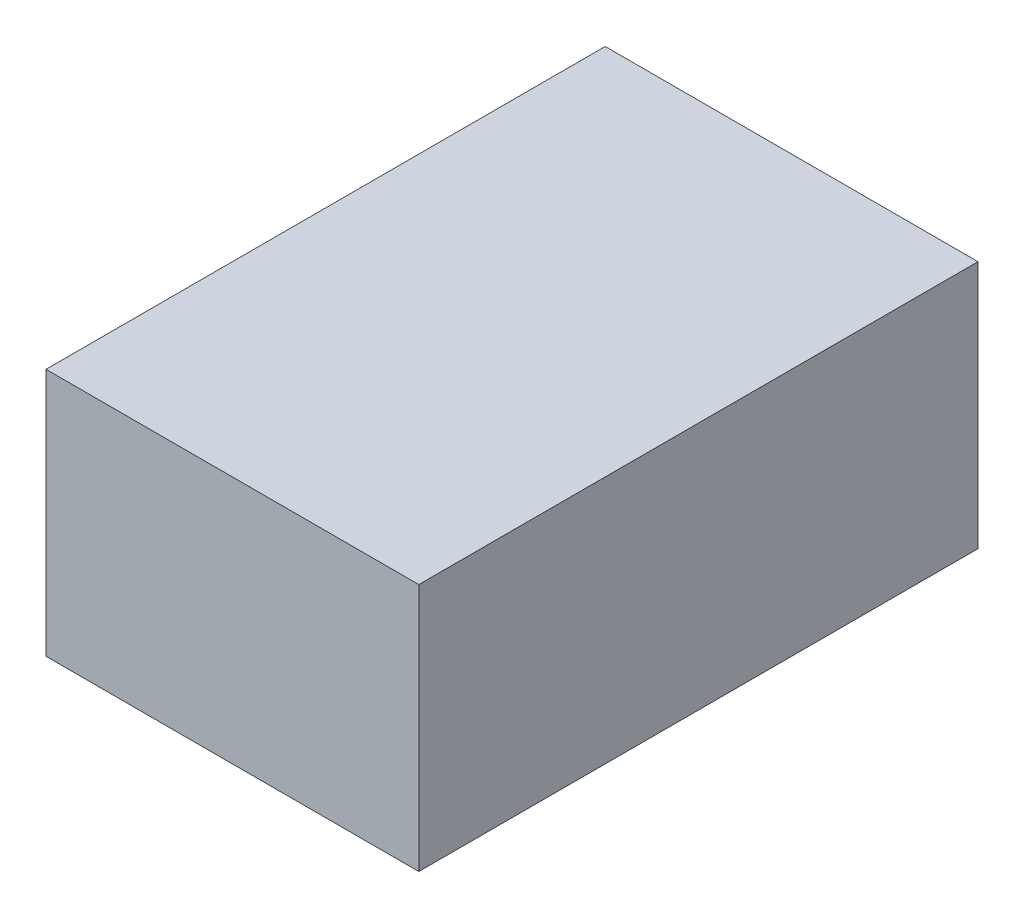
ISO-10303-21;
HEADER;
FILE_DESCRIPTION(('STEP AP214'),'2;1');
FILE_NAME('part.step','',(''),(''),'','','');
FILE_SCHEMA(('AUTOMOTIVE_DESIGN { 1 0 10303 214 1 1 1 1 }'));
ENDSEC;
DATA;
#1=APPLICATION_CONTEXT('core data for automotive mechanical design processes');
#2=APPLICATION_PROTOCOL_DEFINITION('international standard','automotive_design',2000,#1);
#3=PRODUCT_CONTEXT('',#1,'mechanical');
#4=PRODUCT('Part','Part','',(#3));
#5=PRODUCT_RELATED_PRODUCT_CATEGORY('part','',(#4));
#6=PRODUCT_DEFINITION_FORMATION('','',#4);
#7=PRODUCT_DEFINITION_CONTEXT('part definition',#1,'design');
#8=PRODUCT_DEFINITION('design','',#6,#7);
#9=PRODUCT_DEFINITION_SHAPE('','',#8);
#10=(LENGTH_UNIT() NAMED_UNIT(*) SI_UNIT(.MILLI.,.METRE.));
#11=(NAMED_UNIT(*) PLANE_ANGLE_UNIT() SI_UNIT($,.RADIAN.));
#12=(NAMED_UNIT(*) SI_UNIT($,.STERADIAN.) SOLID_ANGLE_UNIT());
#13=UNCERTAINTY_MEASURE_WITH_UNIT(LENGTH_MEASURE(1.E-05),#10,'distance_accuracy_value','');
#14=(GEOMETRIC_REPRESENTATION_CONTEXT(3) GLOBAL_UNCERTAINTY_ASSIGNED_CONTEXT((#13)) GLOBAL_UNIT_ASSIGNED_CONTEXT((#10,
#11,#12)) REPRESENTATION_CONTEXT('',''));
#15=CARTESIAN_POINT('',(0.,0.,0.));
#16=DIRECTION('',(0.,0.,1.));
#17=DIRECTION('',(1.,0.,0.));
#18=AXIS2_PLACEMENT_3D('',#15,#16,#17);
#19=CARTESIAN_POINT('',(76.2,-14.9023121387283,114.3));
#20=DIRECTION('',(0.,1.,0.));
#21=DIRECTION('',(-1.,0.,0.));
#22=AXIS2_PLACEMENT_3D('',#19,#20,#21);
#23=PLANE('',#22);
#24=CARTESIAN_POINT('',(6.35,-14.9023121387283,6.34999999999999));
#25=DIRECTION('',(0.,-1.,0.));
#26=DIRECTION('',(1.,0.,0.));
#27=AXIS2_PLACEMENT_3D('',#24,#25,#26);
#28=CIRCLE('',#27,2.286);
#29=CARTESIAN_POINT('',(8.636,-14.9023121387283,6.34999999999999));
#30=VERTEX_POINT('',#29);
#31=EDGE_CURVE('E243',#30,#30,#28,.T.);
#32=ORIENTED_EDGE('',*,*,#31,.F.);
#33=EDGE_LOOP('',(#32));
#34=FACE_BOUND('',#33,.T.);
#35=CARTESIAN_POINT('',(6.35,-14.9023121387283,107.95));
#36=DIRECTION('',(0.,-1.,0.));
#37=DIRECTION('',(1.,0.,0.));
#38=AXIS2_PLACEMENT_3D('',#35,#36,#37);
#39=CIRCLE('',#38,2.286);
#40=CARTESIAN_POINT('',(8.636,-14.9023121387283,107.95));
#41=VERTEX_POINT('',#40);
#42=EDGE_CURVE('E251',#41,#41,#39,.T.);
#43=ORIENTED_EDGE('',*,*,#42,.F.);
#44=EDGE_LOOP('',(#43));
#45=FACE_BOUND('',#44,.T.);
#46=CARTESIAN_POINT('',(69.85,-14.9023121387283,107.95));
#47=DIRECTION('',(0.,-1.,0.));
#48=DIRECTION('',(1.,0.,0.));
#49=AXIS2_PLACEMENT_3D('',#46,#47,#48);
#50=CIRCLE('',#49,2.28599999999999);
#51=CARTESIAN_POINT('',(72.136,-14.9023121387283,107.95));
#52=VERTEX_POINT('',#51);
#53=EDGE_CURVE('E236',#52,#52,#50,.T.);
#54=ORIENTED_EDGE('',*,*,#53,.F.);
#55=EDGE_LOOP('',(#54));
#56=FACE_BOUND('',#55,.T.);
#57=CARTESIAN_POINT('',(69.85,-14.9023121387283,6.35000000000001));
#58=DIRECTION('',(0.,-1.,0.));
#59=DIRECTION('',(1.,0.,0.));
#60=AXIS2_PLACEMENT_3D('',#57,#58,#59);
#61=CIRCLE('',#60,2.28599999999999);
#62=CARTESIAN_POINT('',(72.136,-14.9023121387283,6.35000000000001));
#63=VERTEX_POINT('',#62);
#64=EDGE_CURVE('E250',#63,#63,#61,.T.);
#65=ORIENTED_EDGE('',*,*,#64,.F.);
#66=EDGE_LOOP('',(#65));
#67=FACE_BOUND('',#66,.T.);
#68=DIRECTION('',(1.,0.,0.));
#69=VECTOR('',#68,1.);
#70=CARTESIAN_POINT('',(76.2,-14.9023121387283,0.));
#71=LINE('',#70,#69);
#72=CARTESIAN_POINT('',(0.,-14.9023121387283,0.));
#73=VERTEX_POINT('',#72);
#74=CARTESIAN_POINT('',(76.2,-14.9023121387283,0.));
#75=VERTEX_POINT('',#74);
#76=EDGE_CURVE('E372',#73,#75,#71,.T.);
#77=ORIENTED_EDGE('',*,*,#76,.T.);
#78=DIRECTION('',(0.,0.,-1.));
#79=VECTOR('',#78,1.);
#80=CARTESIAN_POINT('',(76.2,-14.9023121387283,114.3));
#81=LINE('',#80,#79);
#82=CARTESIAN_POINT('',(76.2,-14.9023121387283,114.3));
#83=VERTEX_POINT('',#82);
#84=EDGE_CURVE('E377',#83,#75,#81,.T.);
#85=ORIENTED_EDGE('',*,*,#84,.F.);
#86=DIRECTION('',(1.,0.,0.));
#87=VECTOR('',#86,1.);
#88=CARTESIAN_POINT('',(76.2,-14.9023121387283,114.3));
#89=LINE('',#88,#87);
#90=CARTESIAN_POINT('',(0.,-14.9023121387283,114.3));
#91=VERTEX_POINT('',#90);
#92=EDGE_CURVE('E363',#91,#83,#89,.T.);
#93=ORIENTED_EDGE('',*,*,#92,.F.);
#94=DIRECTION('',(0.,0.,-1.));
#95=VECTOR('',#94,1.);
#96=CARTESIAN_POINT('',(0.,-14.9023121387283,114.3));
#97=LINE('',#96,#95);
#98=EDGE_CURVE('E380',#91,#73,#97,.T.);
#99=ORIENTED_EDGE('',*,*,#98,.T.);
#100=EDGE_LOOP('',(#77,#85,#93,#99));
#101=FACE_BOUND('',#100,.T.);
#102=DIRECTION('',(-1.,0.,0.));
#103=VECTOR('',#102,1.);
#104=CARTESIAN_POINT('',(0.,-14.9023121387283,10.6679999999999));
#105=LINE('',#104,#103);
#106=CARTESIAN_POINT('',(10.6679999999999,-14.9023121387283,10.6679999999999));
#107=VERTEX_POINT('',#106);
#108=CARTESIAN_POINT('',(1.778,-14.9023121387283,10.6679999999999));
#109=VERTEX_POINT('',#108);
#110=EDGE_CURVE('E266',#107,#109,#105,.T.);
#111=ORIENTED_EDGE('',*,*,#110,.T.);
#112=DIRECTION('',(0.,0.,-1.));
#113=VECTOR('',#112,1.);
#114=CARTESIAN_POINT('',(1.778,-14.9023121387283,0.));
#115=LINE('',#114,#113);
#116=CARTESIAN_POINT('',(1.778,-14.9023121387283,103.632));
#117=VERTEX_POINT('',#116);
#118=EDGE_CURVE('E270',#117,#109,#115,.T.);
#119=ORIENTED_EDGE('',*,*,#118,.F.);
#120=DIRECTION('',(1.,0.,0.));
#121=VECTOR('',#120,1.);
#122=CARTESIAN_POINT('',(0.,-14.9023121387283,103.632));
#123=LINE('',#122,#121);
#124=CARTESIAN_POINT('',(10.668,-14.9023121387283,103.632));
#125=VERTEX_POINT('',#124);
#126=EDGE_CURVE('E327',#117,#125,#123,.T.);
#127=ORIENTED_EDGE('',*,*,#126,.T.);
#128=DIRECTION('',(0.,0.,-1.));
#129=VECTOR('',#128,1.);
#130=CARTESIAN_POINT('',(10.668,-14.9023121387283,0.));
#131=LINE('',#130,#129);
#132=CARTESIAN_POINT('',(10.668,-14.9023121387283,112.522));
#133=VERTEX_POINT('',#132);
#134=EDGE_CURVE('E324',#133,#125,#131,.T.);
#135=ORIENTED_EDGE('',*,*,#134,.F.);
#136=DIRECTION('',(1.,0.,0.));
#137=VECTOR('',#136,1.);
#138=CARTESIAN_POINT('',(0.,-14.9023121387283,112.522));
#139=LINE('',#138,#137);
#140=CARTESIAN_POINT('',(65.532,-14.9023121387283,112.522));
#141=VERTEX_POINT('',#140);
#142=EDGE_CURVE('E321',#133,#141,#139,.T.);
#143=ORIENTED_EDGE('',*,*,#142,.T.);
#144=DIRECTION('',(0.,0.,-1.));
#145=VECTOR('',#144,1.);
#146=CARTESIAN_POINT('',(65.532,-14.9023121387283,0.));
#147=LINE('',#146,#145);
#148=CARTESIAN_POINT('',(65.532,-14.9023121387283,103.632));
#149=VERTEX_POINT('',#148);
#150=EDGE_CURVE('E318',#141,#149,#147,.T.);
#151=ORIENTED_EDGE('',*,*,#150,.T.);
#152=DIRECTION('',(-1.,0.,0.));
#153=VECTOR('',#152,1.);
#154=CARTESIAN_POINT('',(0.,-14.9023121387283,103.632));
#155=LINE('',#154,#153);
#156=CARTESIAN_POINT('',(74.422,-14.9023121387283,103.632));
#157=VERTEX_POINT('',#156);
#158=EDGE_CURVE('E315',#157,#149,#155,.T.);
#159=ORIENTED_EDGE('',*,*,#158,.F.);
#160=DIRECTION('',(0.,0.,-1.));
#161=VECTOR('',#160,1.);
#162=CARTESIAN_POINT('',(74.422,-14.9023121387283,0.));
#163=LINE('',#162,#161);
#164=CARTESIAN_POINT('',(74.422,-14.9023121387283,10.668));
#165=VERTEX_POINT('',#164);
#166=EDGE_CURVE('E312',#157,#165,#163,.T.);
#167=ORIENTED_EDGE('',*,*,#166,.T.);
#168=DIRECTION('',(-1.,0.,0.));
#169=VECTOR('',#168,1.);
#170=CARTESIAN_POINT('',(0.,-14.9023121387283,10.668));
#171=LINE('',#170,#169);
#172=CARTESIAN_POINT('',(65.532,-14.9023121387283,10.668));
#173=VERTEX_POINT('',#172);
#174=EDGE_CURVE('E309',#165,#173,#171,.T.);
#175=ORIENTED_EDGE('',*,*,#174,.T.);
#176=DIRECTION('',(0.,0.,-1.));
#177=VECTOR('',#176,1.);
#178=CARTESIAN_POINT('',(65.532,-14.9023121387283,0.));
#179=LINE('',#178,#177);
#180=CARTESIAN_POINT('',(65.532,-14.9023121387283,1.778));
#181=VERTEX_POINT('',#180);
#182=EDGE_CURVE('E306',#173,#181,#179,.T.);
#183=ORIENTED_EDGE('',*,*,#182,.T.);
#184=DIRECTION('',(1.,0.,0.));
#185=VECTOR('',#184,1.);
#186=CARTESIAN_POINT('',(0.,-14.9023121387283,1.778));
#187=LINE('',#186,#185);
#188=CARTESIAN_POINT('',(10.6679999999999,-14.9023121387283,1.778));
#189=VERTEX_POINT('',#188);
#190=EDGE_CURVE('E303',#189,#181,#187,.T.);
#191=ORIENTED_EDGE('',*,*,#190,.F.);
#192=DIRECTION('',(0.,0.,-1.));
#193=VECTOR('',#192,1.);
#194=CARTESIAN_POINT('',(10.6679999999999,-14.9023121387283,0.));
#195=LINE('',#194,#193);
#196=EDGE_CURVE('E300',#107,#189,#195,.T.);
#197=ORIENTED_EDGE('',*,*,#196,.F.);
#198=EDGE_LOOP('',(#111,#119,#127,#135,#143,#151,#159,#167,#175,#183,#191,#197));
#199=FACE_BOUND('',#198,.T.);
#200=ADVANCED_FACE('F33',(#34,#45,#56,#67,#101,#199),#23,.F.);
#201=CARTESIAN_POINT('',(0.,35.8976878612717,114.3));
#202=DIRECTION('',(0.,-1.,0.));
#203=DIRECTION('',(1.,0.,0.));
#204=AXIS2_PLACEMENT_3D('',#201,#202,#203);
#205=PLANE('',#204);
#206=DIRECTION('',(-1.,0.,0.));
#207=VECTOR('',#206,1.);
#208=CARTESIAN_POINT('',(0.,35.8976878612717,0.));
#209=LINE('',#208,#207);
#210=CARTESIAN_POINT('',(76.2,35.8976878612717,0.));
#211=VERTEX_POINT('',#210);
#212=CARTESIAN_POINT('',(0.,35.8976878612717,0.));
#213=VERTEX_POINT('',#212);
#214=EDGE_CURVE('E334',#211,#213,#209,.T.);
#215=ORIENTED_EDGE('',*,*,#214,.T.);
#216=DIRECTION('',(0.,0.,-1.));
#217=VECTOR('',#216,1.);
#218=CARTESIAN_POINT('',(0.,35.8976878612717,114.3));
#219=LINE('',#218,#217);
#220=CARTESIAN_POINT('',(0.,35.8976878612717,114.3));
#221=VERTEX_POINT('',#220);
#222=EDGE_CURVE('E383',#221,#213,#219,.T.);
#223=ORIENTED_EDGE('',*,*,#222,.F.);
#224=DIRECTION('',(-1.,0.,0.));
#225=VECTOR('',#224,1.);
#226=CARTESIAN_POINT('',(0.,35.8976878612717,114.3));
#227=LINE('',#226,#225);
#228=CARTESIAN_POINT('',(76.2,35.8976878612717,114.3));
#229=VERTEX_POINT('',#228);
#230=EDGE_CURVE('E357',#229,#221,#227,.T.);
#231=ORIENTED_EDGE('',*,*,#230,.F.);
#232=DIRECTION('',(0.,0.,-1.));
#233=VECTOR('',#232,1.);
#234=CARTESIAN_POINT('',(76.2,35.8976878612717,114.3));
#235=LINE('',#234,#233);
#236=EDGE_CURVE('E367',#229,#211,#235,.T.);
#237=ORIENTED_EDGE('',*,*,#236,.T.);
#238=EDGE_LOOP('',(#215,#223,#231,#237));
#239=FACE_BOUND('',#238,.T.);
#240=ADVANCED_FACE('F35',(#239),#205,.F.);
#241=CARTESIAN_POINT('',(0.,35.8976878612717,114.3));
#242=DIRECTION('',(1.,0.,0.));
#243=DIRECTION('',(0.,1.,0.));
#244=AXIS2_PLACEMENT_3D('',#241,#242,#243);
#245=PLANE('',#244);
#246=DIRECTION('',(0.,-1.,0.));
#247=VECTOR('',#246,1.);
#248=CARTESIAN_POINT('',(0.,35.8976878612717,0.));
#249=LINE('',#248,#247);
#250=EDGE_CURVE('E370',#213,#73,#249,.T.);
#251=ORIENTED_EDGE('',*,*,#250,.T.);
#252=ORIENTED_EDGE('',*,*,#98,.F.);
#253=DIRECTION('',(0.,-1.,0.));
#254=VECTOR('',#253,1.);
#255=CARTESIAN_POINT('',(0.,35.8976878612717,114.3));
#256=LINE('',#255,#254);
#257=EDGE_CURVE('E360',#221,#91,#256,.T.);
#258=ORIENTED_EDGE('',*,*,#257,.F.);
#259=ORIENTED_EDGE('',*,*,#222,.T.);
#260=EDGE_LOOP('',(#251,#252,#258,#259));
#261=FACE_BOUND('',#260,.T.);
#262=ADVANCED_FACE('F427',(#261),#245,.F.);
#263=CARTESIAN_POINT('',(76.2,35.8976878612717,114.3));
#264=DIRECTION('',(-1.,0.,0.));
#265=DIRECTION('',(0.,0.,1.));
#266=AXIS2_PLACEMENT_3D('',#263,#264,#265);
#267=PLANE('',#266);
#268=DIRECTION('',(0.,1.,0.));
#269=VECTOR('',#268,1.);
#270=CARTESIAN_POINT('',(76.2,35.8976878612717,0.));
#271=LINE('',#270,#269);
#272=EDGE_CURVE('E361',#75,#211,#271,.T.);
#273=ORIENTED_EDGE('',*,*,#272,.T.);
#274=ORIENTED_EDGE('',*,*,#236,.F.);
#275=DIRECTION('',(0.,1.,0.));
#276=VECTOR('',#275,1.);
#277=CARTESIAN_POINT('',(76.2,35.8976878612717,114.3));
#278=LINE('',#277,#276);
#279=EDGE_CURVE('E365',#83,#229,#278,.T.);
#280=ORIENTED_EDGE('',*,*,#279,.F.);
#281=ORIENTED_EDGE('',*,*,#84,.T.);
#282=EDGE_LOOP('',(#273,#274,#280,#281));
#283=FACE_BOUND('',#282,.T.);
#284=ADVANCED_FACE('F432',(#283),#267,.F.);
#285=CARTESIAN_POINT('',(0.,0.,114.3));
#286=DIRECTION('',(0.,0.,-1.));
#287=DIRECTION('',(-1.,0.,0.));
#288=AXIS2_PLACEMENT_3D('',#285,#286,#287);
#289=PLANE('',#288);
#290=ORIENTED_EDGE('',*,*,#230,.T.);
#291=ORIENTED_EDGE('',*,*,#257,.T.);
#292=ORIENTED_EDGE('',*,*,#92,.T.);
#293=ORIENTED_EDGE('',*,*,#279,.T.);
#294=EDGE_LOOP('',(#290,#291,#292,#293));
#295=FACE_BOUND('',#294,.T.);
#296=ADVANCED_FACE('F439',(#295),#289,.F.);
#297=CARTESIAN_POINT('',(0.,0.,0.));
#298=DIRECTION('',(0.,0.,-1.));
#299=DIRECTION('',(-1.,0.,0.));
#300=AXIS2_PLACEMENT_3D('',#297,#298,#299);
#301=PLANE('',#300);
#302=DIRECTION('',(0.,-1.,0.));
#303=VECTOR('',#302,1.);
#304=CARTESIAN_POINT('',(28.26,33.3576878612717,0.));
#305=LINE('',#304,#303);
#306=CARTESIAN_POINT('',(28.26,33.3576878612717,0.));
#307=VERTEX_POINT('',#306);
#308=CARTESIAN_POINT('',(28.26,18.1176878612717,0.));
#309=VERTEX_POINT('',#308);
#310=EDGE_CURVE('E48',#307,#309,#305,.T.);
#311=ORIENTED_EDGE('',*,*,#310,.F.);
#312=DIRECTION('',(1.,0.,0.));
#313=VECTOR('',#312,1.);
#314=CARTESIAN_POINT('',(28.26,33.3576878612717,0.));
#315=LINE('',#314,#313);
#316=CARTESIAN_POINT('',(11.242,33.3576878612717,0.));
#317=VERTEX_POINT('',#316);
#318=EDGE_CURVE('E213',#317,#307,#315,.T.);
#319=ORIENTED_EDGE('',*,*,#318,.F.);
#320=DIRECTION('',(0.,1.,0.));
#321=VECTOR('',#320,1.);
#322=CARTESIAN_POINT('',(11.242,33.3576878612717,0.));
#323=LINE('',#322,#321);
#324=CARTESIAN_POINT('',(11.242,18.1176878612717,0.));
#325=VERTEX_POINT('',#324);
#326=EDGE_CURVE('E197',#325,#317,#323,.T.);
#327=ORIENTED_EDGE('',*,*,#326,.F.);
#328=DIRECTION('',(-1.,0.,0.));
#329=VECTOR('',#328,1.);
#330=CARTESIAN_POINT('',(28.26,18.1176878612717,0.));
#331=LINE('',#330,#329);
#332=EDGE_CURVE('E206',#309,#325,#331,.T.);
#333=ORIENTED_EDGE('',*,*,#332,.F.);
#334=EDGE_LOOP('',(#311,#319,#327,#333));
#335=FACE_BOUND('',#334,.T.);
#336=DIRECTION('',(0.,-1.,0.));
#337=VECTOR('',#336,1.);
#338=CARTESIAN_POINT('',(63.5,33.3576878612717,0.));
#339=LINE('',#338,#337);
#340=CARTESIAN_POINT('',(63.5,33.3576878612717,0.));
#341=VERTEX_POINT('',#340);
#342=CARTESIAN_POINT('',(63.5,18.1176878612717,0.));
#343=VERTEX_POINT('',#342);
#344=EDGE_CURVE('E220',#341,#343,#339,.T.);
#345=ORIENTED_EDGE('',*,*,#344,.F.);
#346=DIRECTION('',(1.,0.,0.));
#347=VECTOR('',#346,1.);
#348=CARTESIAN_POINT('',(63.5,33.3576878612717,0.));
#349=LINE('',#348,#347);
#350=CARTESIAN_POINT('',(48.26,33.3576878612717,0.));
#351=VERTEX_POINT('',#350);
#352=EDGE_CURVE('E230',#351,#341,#349,.T.);
#353=ORIENTED_EDGE('',*,*,#352,.F.);
#354=DIRECTION('',(0.,1.,0.));
#355=VECTOR('',#354,1.);
#356=CARTESIAN_POINT('',(48.26,33.3576878612717,0.));
#357=LINE('',#356,#355);
#358=CARTESIAN_POINT('',(48.26,18.1176878612717,0.));
#359=VERTEX_POINT('',#358);
#360=EDGE_CURVE('E227',#359,#351,#357,.T.);
#361=ORIENTED_EDGE('',*,*,#360,.F.);
#362=DIRECTION('',(-1.,0.,0.));
#363=VECTOR('',#362,1.);
#364=CARTESIAN_POINT('',(63.5,18.1176878612717,0.));
#365=LINE('',#364,#363);
#366=EDGE_CURVE('E224',#343,#359,#365,.T.);
#367=ORIENTED_EDGE('',*,*,#366,.F.);
#368=EDGE_LOOP('',(#345,#353,#361,#367));
#369=FACE_BOUND('',#368,.T.);
#370=ORIENTED_EDGE('',*,*,#214,.F.);
#371=ORIENTED_EDGE('',*,*,#272,.F.);
#372=ORIENTED_EDGE('',*,*,#76,.F.);
#373=ORIENTED_EDGE('',*,*,#250,.F.);
#374=EDGE_LOOP('',(#370,#371,#372,#373));
#375=FACE_BOUND('',#374,.T.);
#376=ADVANCED_FACE('F210',(#335,#369,#375),#301,.T.);
#377=CARTESIAN_POINT('',(0.,34.1196878612717,10.6679999999999));
#378=DIRECTION('',(0.,0.,1.));
#379=DIRECTION('',(1.,0.,0.));
#380=AXIS2_PLACEMENT_3D('',#377,#378,#379);
#381=PLANE('',#380);
#382=ORIENTED_EDGE('',*,*,#110,.F.);
#383=DIRECTION('',(0.,-1.,0.));
#384=VECTOR('',#383,1.);
#385=CARTESIAN_POINT('',(10.6679999999999,34.1196878612717,10.6679999999999));
#386=LINE('',#385,#384);
#387=CARTESIAN_POINT('',(10.6679999999999,34.1196878612717,10.6679999999999));
#388=VERTEX_POINT('',#387);
#389=EDGE_CURVE('E297',#388,#107,#386,.T.);
#390=ORIENTED_EDGE('',*,*,#389,.F.);
#391=DIRECTION('',(-1.,0.,0.));
#392=VECTOR('',#391,1.);
#393=CARTESIAN_POINT('',(0.,34.1196878612717,10.6679999999999));
#394=LINE('',#393,#392);
#395=CARTESIAN_POINT('',(1.778,34.1196878612717,10.6679999999999));
#396=VERTEX_POINT('',#395);
#397=EDGE_CURVE('E267',#388,#396,#394,.T.);
#398=ORIENTED_EDGE('',*,*,#397,.T.);
#399=DIRECTION('',(0.,-1.,0.));
#400=VECTOR('',#399,1.);
#401=CARTESIAN_POINT('',(1.778,34.1196878612717,10.6679999999999));
#402=LINE('',#401,#400);
#403=EDGE_CURVE('E332',#396,#109,#402,.T.);
#404=ORIENTED_EDGE('',*,*,#403,.T.);
#405=EDGE_LOOP('',(#382,#390,#398,#404));
#406=FACE_BOUND('',#405,.T.);
#407=ADVANCED_FACE('F460',(#406),#381,.T.);
#408=CARTESIAN_POINT('',(1.778,34.1196878612717,0.));
#409=DIRECTION('',(-1.,0.,0.));
#410=DIRECTION('',(0.,-1.,0.));
#411=AXIS2_PLACEMENT_3D('',#408,#409,#410);
#412=PLANE('',#411);
#413=ORIENTED_EDGE('',*,*,#118,.T.);
#414=ORIENTED_EDGE('',*,*,#403,.F.);
#415=DIRECTION('',(0.,0.,-1.));
#416=VECTOR('',#415,1.);
#417=CARTESIAN_POINT('',(1.778,34.1196878612717,0.));
#418=LINE('',#417,#416);
#419=CARTESIAN_POINT('',(1.778,34.1196878612717,103.632));
#420=VERTEX_POINT('',#419);
#421=EDGE_CURVE('E294',#420,#396,#418,.T.);
#422=ORIENTED_EDGE('',*,*,#421,.F.);
#423=DIRECTION('',(0.,-1.,0.));
#424=VECTOR('',#423,1.);
#425=CARTESIAN_POINT('',(1.778,34.1196878612717,103.632));
#426=LINE('',#425,#424);
#427=EDGE_CURVE('E335',#420,#117,#426,.T.);
#428=ORIENTED_EDGE('',*,*,#427,.T.);
#429=EDGE_LOOP('',(#413,#414,#422,#428));
#430=FACE_BOUND('',#429,.T.);
#431=ADVANCED_FACE('F464',(#430),#412,.F.);
#432=CARTESIAN_POINT('',(0.,34.1196878612717,103.632));
#433=DIRECTION('',(0.,0.,-1.));
#434=DIRECTION('',(-1.,0.,0.));
#435=AXIS2_PLACEMENT_3D('',#432,#433,#434);
#436=PLANE('',#435);
#437=ORIENTED_EDGE('',*,*,#126,.F.);
#438=ORIENTED_EDGE('',*,*,#427,.F.);
#439=DIRECTION('',(1.,0.,0.));
#440=VECTOR('',#439,1.);
#441=CARTESIAN_POINT('',(0.,34.1196878612717,103.632));
#442=LINE('',#441,#440);
#443=CARTESIAN_POINT('',(10.668,34.1196878612717,103.632));
#444=VERTEX_POINT('',#443);
#445=EDGE_CURVE('E292',#420,#444,#442,.T.);
#446=ORIENTED_EDGE('',*,*,#445,.T.);
#447=DIRECTION('',(0.,-1.,0.));
#448=VECTOR('',#447,1.);
#449=CARTESIAN_POINT('',(10.668,34.1196878612717,103.632));
#450=LINE('',#449,#448);
#451=EDGE_CURVE('E337',#444,#125,#450,.T.);
#452=ORIENTED_EDGE('',*,*,#451,.T.);
#453=EDGE_LOOP('',(#437,#438,#446,#452));
#454=FACE_BOUND('',#453,.T.);
#455=ADVANCED_FACE('F500',(#454),#436,.T.);
#456=CARTESIAN_POINT('',(10.668,34.1196878612717,0.));
#457=DIRECTION('',(-1.,0.,0.));
#458=DIRECTION('',(0.,0.,1.));
#459=AXIS2_PLACEMENT_3D('',#456,#457,#458);
#460=PLANE('',#459);
#461=ORIENTED_EDGE('',*,*,#134,.T.);
#462=ORIENTED_EDGE('',*,*,#451,.F.);
#463=DIRECTION('',(0.,0.,-1.));
#464=VECTOR('',#463,1.);
#465=CARTESIAN_POINT('',(10.668,34.1196878612717,0.));
#466=LINE('',#465,#464);
#467=CARTESIAN_POINT('',(10.668,34.1196878612717,112.522));
#468=VERTEX_POINT('',#467);
#469=EDGE_CURVE('E289',#468,#444,#466,.T.);
#470=ORIENTED_EDGE('',*,*,#469,.F.);
#471=DIRECTION('',(0.,-1.,0.));
#472=VECTOR('',#471,1.);
#473=CARTESIAN_POINT('',(10.668,34.1196878612717,112.522));
#474=LINE('',#473,#472);
#475=EDGE_CURVE('E339',#468,#133,#474,.T.);
#476=ORIENTED_EDGE('',*,*,#475,.T.);
#477=EDGE_LOOP('',(#461,#462,#470,#476));
#478=FACE_BOUND('',#477,.T.);
#479=ADVANCED_FACE('F496',(#478),#460,.F.);
#480=CARTESIAN_POINT('',(0.,34.1196878612717,112.522));
#481=DIRECTION('',(0.,0.,-1.));
#482=DIRECTION('',(-1.,0.,0.));
#483=AXIS2_PLACEMENT_3D('',#480,#481,#482);
#484=PLANE('',#483);
#485=ORIENTED_EDGE('',*,*,#142,.F.);
#486=ORIENTED_EDGE('',*,*,#475,.F.);
#487=DIRECTION('',(1.,0.,0.));
#488=VECTOR('',#487,1.);
#489=CARTESIAN_POINT('',(0.,34.1196878612717,112.522));
#490=LINE('',#489,#488);
#491=CARTESIAN_POINT('',(65.532,34.1196878612717,112.522));
#492=VERTEX_POINT('',#491);
#493=EDGE_CURVE('E287',#468,#492,#490,.T.);
#494=ORIENTED_EDGE('',*,*,#493,.T.);
#495=DIRECTION('',(0.,-1.,0.));
#496=VECTOR('',#495,1.);
#497=CARTESIAN_POINT('',(65.532,34.1196878612717,112.522));
#498=LINE('',#497,#496);
#499=EDGE_CURVE('E341',#492,#141,#498,.T.);
#500=ORIENTED_EDGE('',*,*,#499,.T.);
#501=EDGE_LOOP('',(#485,#486,#494,#500));
#502=FACE_BOUND('',#501,.T.);
#503=ADVANCED_FACE('F492',(#502),#484,.T.);
#504=CARTESIAN_POINT('',(65.532,34.1196878612717,0.));
#505=DIRECTION('',(-1.,0.,0.));
#506=DIRECTION('',(0.,-1.,0.));
#507=AXIS2_PLACEMENT_3D('',#504,#505,#506);
#508=PLANE('',#507);
#509=ORIENTED_EDGE('',*,*,#150,.F.);
#510=ORIENTED_EDGE('',*,*,#499,.F.);
#511=DIRECTION('',(0.,0.,-1.));
#512=VECTOR('',#511,1.);
#513=CARTESIAN_POINT('',(65.532,34.1196878612717,0.));
#514=LINE('',#513,#512);
#515=CARTESIAN_POINT('',(65.532,34.1196878612717,103.632));
#516=VERTEX_POINT('',#515);
#517=EDGE_CURVE('E285',#492,#516,#514,.T.);
#518=ORIENTED_EDGE('',*,*,#517,.T.);
#519=DIRECTION('',(0.,-1.,0.));
#520=VECTOR('',#519,1.);
#521=CARTESIAN_POINT('',(65.532,34.1196878612717,103.632));
#522=LINE('',#521,#520);
#523=EDGE_CURVE('E343',#516,#149,#522,.T.);
#524=ORIENTED_EDGE('',*,*,#523,.T.);
#525=EDGE_LOOP('',(#509,#510,#518,#524));
#526=FACE_BOUND('',#525,.T.);
#527=ADVANCED_FACE('F488',(#526),#508,.T.);
#528=CARTESIAN_POINT('',(0.,34.1196878612717,103.632));
#529=DIRECTION('',(0.,0.,1.));
#530=DIRECTION('',(1.,0.,0.));
#531=AXIS2_PLACEMENT_3D('',#528,#529,#530);
#532=PLANE('',#531);
#533=ORIENTED_EDGE('',*,*,#158,.T.);
#534=ORIENTED_EDGE('',*,*,#523,.F.);
#535=DIRECTION('',(-1.,0.,0.));
#536=VECTOR('',#535,1.);
#537=CARTESIAN_POINT('',(0.,34.1196878612717,103.632));
#538=LINE('',#537,#536);
#539=CARTESIAN_POINT('',(74.422,34.1196878612717,103.632));
#540=VERTEX_POINT('',#539);
#541=EDGE_CURVE('E282',#540,#516,#538,.T.);
#542=ORIENTED_EDGE('',*,*,#541,.F.);
#543=DIRECTION('',(0.,-1.,0.));
#544=VECTOR('',#543,1.);
#545=CARTESIAN_POINT('',(74.422,34.1196878612717,103.632));
#546=LINE('',#545,#544);
#547=EDGE_CURVE('E345',#540,#157,#546,.T.);
#548=ORIENTED_EDGE('',*,*,#547,.T.);
#549=EDGE_LOOP('',(#533,#534,#542,#548));
#550=FACE_BOUND('',#549,.T.);
#551=ADVANCED_FACE('F484',(#550),#532,.F.);
#552=CARTESIAN_POINT('',(74.422,34.1196878612717,0.));
#553=DIRECTION('',(-1.,0.,0.));
#554=DIRECTION('',(0.,-1.,0.));
#555=AXIS2_PLACEMENT_3D('',#552,#553,#554);
#556=PLANE('',#555);
#557=ORIENTED_EDGE('',*,*,#166,.F.);
#558=ORIENTED_EDGE('',*,*,#547,.F.);
#559=DIRECTION('',(0.,0.,-1.));
#560=VECTOR('',#559,1.);
#561=CARTESIAN_POINT('',(74.422,34.1196878612717,0.));
#562=LINE('',#561,#560);
#563=CARTESIAN_POINT('',(74.422,34.1196878612717,10.668));
#564=VERTEX_POINT('',#563);
#565=EDGE_CURVE('E280',#540,#564,#562,.T.);
#566=ORIENTED_EDGE('',*,*,#565,.T.);
#567=DIRECTION('',(0.,-1.,0.));
#568=VECTOR('',#567,1.);
#569=CARTESIAN_POINT('',(74.422,34.1196878612717,10.668));
#570=LINE('',#569,#568);
#571=EDGE_CURVE('E347',#564,#165,#570,.T.);
#572=ORIENTED_EDGE('',*,*,#571,.T.);
#573=EDGE_LOOP('',(#557,#558,#566,#572));
#574=FACE_BOUND('',#573,.T.);
#575=ADVANCED_FACE('F480',(#574),#556,.T.);
#576=CARTESIAN_POINT('',(0.,34.1196878612717,10.668));
#577=DIRECTION('',(0.,0.,1.));
#578=DIRECTION('',(1.,0.,0.));
#579=AXIS2_PLACEMENT_3D('',#576,#577,#578);
#580=PLANE('',#579);
#581=ORIENTED_EDGE('',*,*,#174,.F.);
#582=ORIENTED_EDGE('',*,*,#571,.F.);
#583=DIRECTION('',(-1.,0.,0.));
#584=VECTOR('',#583,1.);
#585=CARTESIAN_POINT('',(0.,34.1196878612717,10.668));
#586=LINE('',#585,#584);
#587=CARTESIAN_POINT('',(65.532,34.1196878612717,10.668));
#588=VERTEX_POINT('',#587);
#589=EDGE_CURVE('E278',#564,#588,#586,.T.);
#590=ORIENTED_EDGE('',*,*,#589,.T.);
#591=DIRECTION('',(0.,-1.,0.));
#592=VECTOR('',#591,1.);
#593=CARTESIAN_POINT('',(65.532,34.1196878612717,10.668));
#594=LINE('',#593,#592);
#595=EDGE_CURVE('E349',#588,#173,#594,.T.);
#596=ORIENTED_EDGE('',*,*,#595,.T.);
#597=EDGE_LOOP('',(#581,#582,#590,#596));
#598=FACE_BOUND('',#597,.T.);
#599=ADVANCED_FACE('F476',(#598),#580,.T.);
#600=CARTESIAN_POINT('',(65.532,34.1196878612717,0.));
#601=DIRECTION('',(-1.,0.,0.));
#602=DIRECTION('',(0.,-1.,0.));
#603=AXIS2_PLACEMENT_3D('',#600,#601,#602);
#604=PLANE('',#603);
#605=ORIENTED_EDGE('',*,*,#182,.F.);
#606=ORIENTED_EDGE('',*,*,#595,.F.);
#607=DIRECTION('',(0.,0.,-1.));
#608=VECTOR('',#607,1.);
#609=CARTESIAN_POINT('',(65.532,34.1196878612717,0.));
#610=LINE('',#609,#608);
#611=CARTESIAN_POINT('',(65.532,34.1196878612717,1.778));
#612=VERTEX_POINT('',#611);
#613=EDGE_CURVE('E276',#588,#612,#610,.T.);
#614=ORIENTED_EDGE('',*,*,#613,.T.);
#615=DIRECTION('',(0.,-1.,0.));
#616=VECTOR('',#615,1.);
#617=CARTESIAN_POINT('',(65.532,34.1196878612717,1.778));
#618=LINE('',#617,#616);
#619=EDGE_CURVE('E351',#612,#181,#618,.T.);
#620=ORIENTED_EDGE('',*,*,#619,.T.);
#621=EDGE_LOOP('',(#605,#606,#614,#620));
#622=FACE_BOUND('',#621,.T.);
#623=ADVANCED_FACE('F473',(#622),#604,.T.);
#624=CARTESIAN_POINT('',(0.,34.1196878612717,1.778));
#625=DIRECTION('',(0.,0.,-1.));
#626=DIRECTION('',(-1.,0.,0.));
#627=AXIS2_PLACEMENT_3D('',#624,#625,#626);
#628=PLANE('',#627);
#629=DIRECTION('',(1.,0.,0.));
#630=VECTOR('',#629,1.);
#631=CARTESIAN_POINT('',(0.,33.3576878612717,1.778));
#632=LINE('',#631,#630);
#633=CARTESIAN_POINT('',(11.242,33.3576878612717,1.778));
#634=VERTEX_POINT('',#633);
#635=CARTESIAN_POINT('',(28.26,33.3576878612717,1.778));
#636=VERTEX_POINT('',#635);
#637=EDGE_CURVE('E41',#634,#636,#632,.T.);
#638=ORIENTED_EDGE('',*,*,#637,.T.);
#639=DIRECTION('',(0.,-1.,0.));
#640=VECTOR('',#639,1.);
#641=CARTESIAN_POINT('',(28.26,34.1196878612717,1.778));
#642=LINE('',#641,#640);
#643=CARTESIAN_POINT('',(28.26,18.1176878612717,1.778));
#644=VERTEX_POINT('',#643);
#645=EDGE_CURVE('E11',#636,#644,#642,.T.);
#646=ORIENTED_EDGE('',*,*,#645,.T.);
#647=DIRECTION('',(-1.,0.,0.));
#648=VECTOR('',#647,1.);
#649=CARTESIAN_POINT('',(0.,18.1176878612717,1.778));
#650=LINE('',#649,#648);
#651=CARTESIAN_POINT('',(11.242,18.1176878612717,1.778));
#652=VERTEX_POINT('',#651);
#653=EDGE_CURVE('E398',#644,#652,#650,.T.);
#654=ORIENTED_EDGE('',*,*,#653,.T.);
#655=DIRECTION('',(0.,1.,0.));
#656=VECTOR('',#655,1.);
#657=CARTESIAN_POINT('',(11.242,34.1196878612717,1.778));
#658=LINE('',#657,#656);
#659=EDGE_CURVE('E200',#652,#634,#658,.T.);
#660=ORIENTED_EDGE('',*,*,#659,.T.);
#661=EDGE_LOOP('',(#638,#646,#654,#660));
#662=FACE_BOUND('',#661,.T.);
#663=DIRECTION('',(1.,0.,0.));
#664=VECTOR('',#663,1.);
#665=CARTESIAN_POINT('',(0.,33.3576878612717,1.778));
#666=LINE('',#665,#664);
#667=CARTESIAN_POINT('',(48.26,33.3576878612717,1.778));
#668=VERTEX_POINT('',#667);
#669=CARTESIAN_POINT('',(63.5,33.3576878612717,1.778));
#670=VERTEX_POINT('',#669);
#671=EDGE_CURVE('E392',#668,#670,#666,.T.);
#672=ORIENTED_EDGE('',*,*,#671,.T.);
#673=DIRECTION('',(0.,-1.,0.));
#674=VECTOR('',#673,1.);
#675=CARTESIAN_POINT('',(63.5,34.1196878612717,1.778));
#676=LINE('',#675,#674);
#677=CARTESIAN_POINT('',(63.5,18.1176878612717,1.778));
#678=VERTEX_POINT('',#677);
#679=EDGE_CURVE('E395',#670,#678,#676,.T.);
#680=ORIENTED_EDGE('',*,*,#679,.T.);
#681=DIRECTION('',(-1.,0.,0.));
#682=VECTOR('',#681,1.);
#683=CARTESIAN_POINT('',(0.,18.1176878612717,1.778));
#684=LINE('',#683,#682);
#685=CARTESIAN_POINT('',(48.26,18.1176878612717,1.778));
#686=VERTEX_POINT('',#685);
#687=EDGE_CURVE('E386',#678,#686,#684,.T.);
#688=ORIENTED_EDGE('',*,*,#687,.T.);
#689=DIRECTION('',(0.,1.,0.));
#690=VECTOR('',#689,1.);
#691=CARTESIAN_POINT('',(48.26,34.1196878612717,1.778));
#692=LINE('',#691,#690);
#693=EDGE_CURVE('E389',#686,#668,#692,.T.);
#694=ORIENTED_EDGE('',*,*,#693,.T.);
#695=EDGE_LOOP('',(#672,#680,#688,#694));
#696=FACE_BOUND('',#695,.T.);
#697=ORIENTED_EDGE('',*,*,#190,.T.);
#698=ORIENTED_EDGE('',*,*,#619,.F.);
#699=DIRECTION('',(1.,0.,0.));
#700=VECTOR('',#699,1.);
#701=CARTESIAN_POINT('',(0.,34.1196878612717,1.778));
#702=LINE('',#701,#700);
#703=CARTESIAN_POINT('',(10.6679999999999,34.1196878612717,1.778));
#704=VERTEX_POINT('',#703);
#705=EDGE_CURVE('E273',#704,#612,#702,.T.);
#706=ORIENTED_EDGE('',*,*,#705,.F.);
#707=DIRECTION('',(0.,-1.,0.));
#708=VECTOR('',#707,1.);
#709=CARTESIAN_POINT('',(10.6679999999999,34.1196878612717,1.778));
#710=LINE('',#709,#708);
#711=EDGE_CURVE('E353',#704,#189,#710,.T.);
#712=ORIENTED_EDGE('',*,*,#711,.T.);
#713=EDGE_LOOP('',(#697,#698,#706,#712));
#714=FACE_BOUND('',#713,.T.);
#715=ADVANCED_FACE('F402',(#662,#696,#714),#628,.F.);
#716=CARTESIAN_POINT('',(10.6679999999999,34.1196878612717,0.));
#717=DIRECTION('',(-1.,0.,0.));
#718=DIRECTION('',(0.,-1.,0.));
#719=AXIS2_PLACEMENT_3D('',#716,#717,#718);
#720=PLANE('',#719);
#721=ORIENTED_EDGE('',*,*,#196,.T.);
#722=ORIENTED_EDGE('',*,*,#711,.F.);
#723=DIRECTION('',(0.,0.,-1.));
#724=VECTOR('',#723,1.);
#725=CARTESIAN_POINT('',(10.6679999999999,34.1196878612717,0.));
#726=LINE('',#725,#724);
#727=EDGE_CURVE('E269',#388,#704,#726,.T.);
#728=ORIENTED_EDGE('',*,*,#727,.F.);
#729=ORIENTED_EDGE('',*,*,#389,.T.);
#730=EDGE_LOOP('',(#721,#722,#728,#729));
#731=FACE_BOUND('',#730,.T.);
#732=ADVANCED_FACE('F466',(#731),#720,.F.);
#733=CARTESIAN_POINT('',(0.,34.1196878612717,0.));
#734=DIRECTION('',(0.,-1.,0.));
#735=DIRECTION('',(1.,0.,0.));
#736=AXIS2_PLACEMENT_3D('',#733,#734,#735);
#737=PLANE('',#736);
#738=ORIENTED_EDGE('',*,*,#397,.F.);
#739=ORIENTED_EDGE('',*,*,#727,.T.);
#740=ORIENTED_EDGE('',*,*,#705,.T.);
#741=ORIENTED_EDGE('',*,*,#613,.F.);
#742=ORIENTED_EDGE('',*,*,#589,.F.);
#743=ORIENTED_EDGE('',*,*,#565,.F.);
#744=ORIENTED_EDGE('',*,*,#541,.T.);
#745=ORIENTED_EDGE('',*,*,#517,.F.);
#746=ORIENTED_EDGE('',*,*,#493,.F.);
#747=ORIENTED_EDGE('',*,*,#469,.T.);
#748=ORIENTED_EDGE('',*,*,#445,.F.);
#749=ORIENTED_EDGE('',*,*,#421,.T.);
#750=EDGE_LOOP('',(#738,#739,#740,#741,#742,#743,#744,#745,#746,#747,#748,#749));
#751=FACE_BOUND('',#750,.T.);
#752=ADVANCED_FACE('F469',(#751),#737,.T.);
#753=CARTESIAN_POINT('',(69.85,-14.9023121387283,6.35000000000001));
#754=DIRECTION('',(0.,-1.,0.));
#755=DIRECTION('',(1.,0.,0.));
#756=AXIS2_PLACEMENT_3D('',#753,#754,#755);
#757=CONICAL_SURFACE('',#756,2.28599999999999,0.05235987755983);
#758=CARTESIAN_POINT('',(69.85,-9.82231213872831,6.35000000000001));
#759=DIRECTION('',(0.,-1.,0.));
#760=DIRECTION('',(1.,0.,0.));
#761=AXIS2_PLACEMENT_3D('',#758,#759,#760);
#762=CIRCLE('',#761,2.01976848124214);
#763=CARTESIAN_POINT('',(71.8697684812422,-9.82231213872831,6.35000000000001));
#764=VERTEX_POINT('',#763);
#765=EDGE_CURVE('E263',#764,#764,#762,.T.);
#766=ORIENTED_EDGE('',*,*,#765,.F.);
#767=EDGE_LOOP('',(#766));
#768=FACE_BOUND('',#767,.T.);
#769=ORIENTED_EDGE('',*,*,#64,.T.);
#770=EDGE_LOOP('',(#769));
#771=FACE_BOUND('',#770,.T.);
#772=ADVANCED_FACE('F510',(#768,#771),#757,.F.);
#773=CARTESIAN_POINT('',(69.85,-9.82231213872831,6.35000000000001));
#774=DIRECTION('',(0.,-1.,0.));
#775=DIRECTION('',(1.,0.,0.));
#776=AXIS2_PLACEMENT_3D('',#773,#774,#775);
#777=PLANE('',#776);
#778=ORIENTED_EDGE('',*,*,#765,.T.);
#779=EDGE_LOOP('',(#778));
#780=FACE_BOUND('',#779,.T.);
#781=ADVANCED_FACE('F514',(#780),#777,.T.);
#782=CARTESIAN_POINT('',(69.85,-14.9023121387283,107.95));
#783=DIRECTION('',(0.,-1.,0.));
#784=DIRECTION('',(1.,0.,0.));
#785=AXIS2_PLACEMENT_3D('',#782,#783,#784);
#786=CONICAL_SURFACE('',#785,2.28599999999999,0.05235987755983);
#787=CARTESIAN_POINT('',(69.85,-9.82231213872831,107.95));
#788=DIRECTION('',(0.,-1.,0.));
#789=DIRECTION('',(1.,0.,0.));
#790=AXIS2_PLACEMENT_3D('',#787,#788,#789);
#791=CIRCLE('',#790,2.01976848124214);
#792=CARTESIAN_POINT('',(71.8697684812421,-9.82231213872831,107.95));
#793=VERTEX_POINT('',#792);
#794=EDGE_CURVE('E254',#793,#793,#791,.T.);
#795=ORIENTED_EDGE('',*,*,#794,.F.);
#796=EDGE_LOOP('',(#795));
#797=FACE_BOUND('',#796,.T.);
#798=ORIENTED_EDGE('',*,*,#53,.T.);
#799=EDGE_LOOP('',(#798));
#800=FACE_BOUND('',#799,.T.);
#801=ADVANCED_FACE('F518',(#797,#800),#786,.F.);
#802=CARTESIAN_POINT('',(69.85,-9.82231213872831,107.95));
#803=DIRECTION('',(0.,-1.,0.));
#804=DIRECTION('',(1.,0.,0.));
#805=AXIS2_PLACEMENT_3D('',#802,#803,#804);
#806=PLANE('',#805);
#807=ORIENTED_EDGE('',*,*,#794,.T.);
#808=EDGE_LOOP('',(#807));
#809=FACE_BOUND('',#808,.T.);
#810=ADVANCED_FACE('F522',(#809),#806,.T.);
#811=CARTESIAN_POINT('',(6.35,-14.9023121387283,107.95));
#812=DIRECTION('',(0.,-1.,0.));
#813=DIRECTION('',(1.,0.,0.));
#814=AXIS2_PLACEMENT_3D('',#811,#812,#813);
#815=CONICAL_SURFACE('',#814,2.286,0.05235987755983);
#816=CARTESIAN_POINT('',(6.35,-9.82231213872832,107.95));
#817=DIRECTION('',(0.,-1.,0.));
#818=DIRECTION('',(1.,0.,0.));
#819=AXIS2_PLACEMENT_3D('',#816,#817,#818);
#820=CIRCLE('',#819,2.01976848124215);
#821=CARTESIAN_POINT('',(8.36976848124215,-9.82231213872832,107.95));
#822=VERTEX_POINT('',#821);
#823=EDGE_CURVE('E247',#822,#822,#820,.T.);
#824=ORIENTED_EDGE('',*,*,#823,.F.);
#825=EDGE_LOOP('',(#824));
#826=FACE_BOUND('',#825,.T.);
#827=ORIENTED_EDGE('',*,*,#42,.T.);
#828=EDGE_LOOP('',(#827));
#829=FACE_BOUND('',#828,.T.);
#830=ADVANCED_FACE('F526',(#826,#829),#815,.F.);
#831=CARTESIAN_POINT('',(6.35,-9.82231213872832,107.95));
#832=DIRECTION('',(0.,-1.,0.));
#833=DIRECTION('',(1.,0.,0.));
#834=AXIS2_PLACEMENT_3D('',#831,#832,#833);
#835=PLANE('',#834);
#836=ORIENTED_EDGE('',*,*,#823,.T.);
#837=EDGE_LOOP('',(#836));
#838=FACE_BOUND('',#837,.T.);
#839=ADVANCED_FACE('F530',(#838),#835,.T.);
#840=CARTESIAN_POINT('',(6.35,-14.9023121387283,6.34999999999999));
#841=DIRECTION('',(0.,-1.,0.));
#842=DIRECTION('',(1.,0.,0.));
#843=AXIS2_PLACEMENT_3D('',#840,#841,#842);
#844=CONICAL_SURFACE('',#843,2.286,0.05235987755983);
#845=CARTESIAN_POINT('',(6.35,-9.82231213872832,6.34999999999999));
#846=DIRECTION('',(0.,-1.,0.));
#847=DIRECTION('',(1.,0.,0.));
#848=AXIS2_PLACEMENT_3D('',#845,#846,#847);
#849=CIRCLE('',#848,2.01976848124215);
#850=CARTESIAN_POINT('',(8.36976848124215,-9.82231213872832,6.34999999999999));
#851=VERTEX_POINT('',#850);
#852=EDGE_CURVE('E246',#851,#851,#849,.T.);
#853=ORIENTED_EDGE('',*,*,#852,.F.);
#854=EDGE_LOOP('',(#853));
#855=FACE_BOUND('',#854,.T.);
#856=ORIENTED_EDGE('',*,*,#31,.T.);
#857=EDGE_LOOP('',(#856));
#858=FACE_BOUND('',#857,.T.);
#859=ADVANCED_FACE('F534',(#855,#858),#844,.F.);
#860=CARTESIAN_POINT('',(6.35,-9.82231213872832,6.34999999999999));
#861=DIRECTION('',(0.,-1.,0.));
#862=DIRECTION('',(1.,0.,0.));
#863=AXIS2_PLACEMENT_3D('',#860,#861,#862);
#864=PLANE('',#863);
#865=ORIENTED_EDGE('',*,*,#852,.T.);
#866=EDGE_LOOP('',(#865));
#867=FACE_BOUND('',#866,.T.);
#868=ADVANCED_FACE('F538',(#867),#864,.T.);
#869=CARTESIAN_POINT('',(63.5,33.3576878612717,5.08));
#870=DIRECTION('',(1.,0.,0.));
#871=DIRECTION('',(0.,0.,-1.));
#872=AXIS2_PLACEMENT_3D('',#869,#870,#871);
#873=PLANE('',#872);
#874=DIRECTION('',(0.,0.,-1.));
#875=VECTOR('',#874,1.);
#876=CARTESIAN_POINT('',(63.5,33.3576878612717,5.08));
#877=LINE('',#876,#875);
#878=EDGE_CURVE('E234',#670,#341,#877,.T.);
#879=ORIENTED_EDGE('',*,*,#878,.T.);
#880=ORIENTED_EDGE('',*,*,#344,.T.);
#881=DIRECTION('',(0.,0.,-1.));
#882=VECTOR('',#881,1.);
#883=CARTESIAN_POINT('',(63.5,18.1176878612717,5.08));
#884=LINE('',#883,#882);
#885=EDGE_CURVE('E233',#678,#343,#884,.T.);
#886=ORIENTED_EDGE('',*,*,#885,.F.);
#887=ORIENTED_EDGE('',*,*,#679,.F.);
#888=EDGE_LOOP('',(#879,#880,#886,#887));
#889=FACE_BOUND('',#888,.T.);
#890=ADVANCED_FACE('F542',(#889),#873,.F.);
#891=CARTESIAN_POINT('',(63.5,33.3576878612717,5.08));
#892=DIRECTION('',(0.,1.,0.));
#893=DIRECTION('',(-1.,0.,0.));
#894=AXIS2_PLACEMENT_3D('',#891,#892,#893);
#895=PLANE('',#894);
#896=DIRECTION('',(0.,0.,-1.));
#897=VECTOR('',#896,1.);
#898=CARTESIAN_POINT('',(48.26,33.3576878612717,5.08));
#899=LINE('',#898,#897);
#900=EDGE_CURVE('E237',#668,#351,#899,.T.);
#901=ORIENTED_EDGE('',*,*,#900,.T.);
#902=ORIENTED_EDGE('',*,*,#352,.T.);
#903=ORIENTED_EDGE('',*,*,#878,.F.);
#904=ORIENTED_EDGE('',*,*,#671,.F.);
#905=EDGE_LOOP('',(#901,#902,#903,#904));
#906=FACE_BOUND('',#905,.T.);
#907=ADVANCED_FACE('F545',(#906),#895,.F.);
#908=CARTESIAN_POINT('',(48.26,33.3576878612717,5.08));
#909=DIRECTION('',(-1.,0.,0.));
#910=DIRECTION('',(0.,-1.,0.));
#911=AXIS2_PLACEMENT_3D('',#908,#909,#910);
#912=PLANE('',#911);
#913=DIRECTION('',(0.,0.,-1.));
#914=VECTOR('',#913,1.);
#915=CARTESIAN_POINT('',(48.26,18.1176878612717,5.08));
#916=LINE('',#915,#914);
#917=EDGE_CURVE('E239',#686,#359,#916,.T.);
#918=ORIENTED_EDGE('',*,*,#917,.T.);
#919=ORIENTED_EDGE('',*,*,#360,.T.);
#920=ORIENTED_EDGE('',*,*,#900,.F.);
#921=ORIENTED_EDGE('',*,*,#693,.F.);
#922=EDGE_LOOP('',(#918,#919,#920,#921));
#923=FACE_BOUND('',#922,.T.);
#924=ADVANCED_FACE('F416',(#923),#912,.F.);
#925=CARTESIAN_POINT('',(63.5,18.1176878612717,5.08));
#926=DIRECTION('',(0.,-1.,0.));
#927=DIRECTION('',(1.,0.,0.));
#928=AXIS2_PLACEMENT_3D('',#925,#926,#927);
#929=PLANE('',#928);
#930=ORIENTED_EDGE('',*,*,#885,.T.);
#931=ORIENTED_EDGE('',*,*,#366,.T.);
#932=ORIENTED_EDGE('',*,*,#917,.F.);
#933=ORIENTED_EDGE('',*,*,#687,.F.);
#934=EDGE_LOOP('',(#930,#931,#932,#933));
#935=FACE_BOUND('',#934,.T.);
#936=ADVANCED_FACE('F409',(#935),#929,.F.);
#937=CARTESIAN_POINT('',(28.26,33.3576878612717,5.08));
#938=DIRECTION('',(1.,0.,0.));
#939=DIRECTION('',(0.,1.,0.));
#940=AXIS2_PLACEMENT_3D('',#937,#938,#939);
#941=PLANE('',#940);
#942=DIRECTION('',(0.,0.,-1.));
#943=VECTOR('',#942,1.);
#944=CARTESIAN_POINT('',(28.26,33.3576878612717,5.08));
#945=LINE('',#944,#943);
#946=EDGE_CURVE('E218',#636,#307,#945,.T.);
#947=ORIENTED_EDGE('',*,*,#946,.T.);
#948=ORIENTED_EDGE('',*,*,#310,.T.);
#949=DIRECTION('',(0.,0.,-1.));
#950=VECTOR('',#949,1.);
#951=CARTESIAN_POINT('',(28.26,18.1176878612717,5.08));
#952=LINE('',#951,#950);
#953=EDGE_CURVE('E203',#644,#309,#952,.T.);
#954=ORIENTED_EDGE('',*,*,#953,.F.);
#955=ORIENTED_EDGE('',*,*,#645,.F.);
#956=EDGE_LOOP('',(#947,#948,#954,#955));
#957=FACE_BOUND('',#956,.T.);
#958=ADVANCED_FACE('F407',(#957),#941,.F.);
#959=CARTESIAN_POINT('',(28.26,33.3576878612717,5.08));
#960=DIRECTION('',(0.,1.,0.));
#961=DIRECTION('',(0.,0.,1.));
#962=AXIS2_PLACEMENT_3D('',#959,#960,#961);
#963=PLANE('',#962);
#964=DIRECTION('',(0.,0.,-1.));
#965=VECTOR('',#964,1.);
#966=CARTESIAN_POINT('',(11.242,33.3576878612717,5.08));
#967=LINE('',#966,#965);
#968=EDGE_CURVE('E202',#634,#317,#967,.T.);
#969=ORIENTED_EDGE('',*,*,#968,.T.);
#970=ORIENTED_EDGE('',*,*,#318,.T.);
#971=ORIENTED_EDGE('',*,*,#946,.F.);
#972=ORIENTED_EDGE('',*,*,#637,.F.);
#973=EDGE_LOOP('',(#969,#970,#971,#972));
#974=FACE_BOUND('',#973,.T.);
#975=ADVANCED_FACE('F406',(#974),#963,.F.);
#976=CARTESIAN_POINT('',(11.242,33.3576878612717,5.08));
#977=DIRECTION('',(-1.,0.,0.));
#978=DIRECTION('',(0.,-1.,0.));
#979=AXIS2_PLACEMENT_3D('',#976,#977,#978);
#980=PLANE('',#979);
#981=DIRECTION('',(0.,0.,-1.));
#982=VECTOR('',#981,1.);
#983=CARTESIAN_POINT('',(11.242,18.1176878612717,5.08));
#984=LINE('',#983,#982);
#985=EDGE_CURVE('E56',#652,#325,#984,.T.);
#986=ORIENTED_EDGE('',*,*,#985,.T.);
#987=ORIENTED_EDGE('',*,*,#326,.T.);
#988=ORIENTED_EDGE('',*,*,#968,.F.);
#989=ORIENTED_EDGE('',*,*,#659,.F.);
#990=EDGE_LOOP('',(#986,#987,#988,#989));
#991=FACE_BOUND('',#990,.T.);
#992=ADVANCED_FACE('F194',(#991),#980,.F.);
#993=CARTESIAN_POINT('',(28.26,18.1176878612717,5.08));
#994=DIRECTION('',(0.,-1.,0.));
#995=DIRECTION('',(0.,0.,-1.));
#996=AXIS2_PLACEMENT_3D('',#993,#994,#995);
#997=PLANE('',#996);
#998=ORIENTED_EDGE('',*,*,#953,.T.);
#999=ORIENTED_EDGE('',*,*,#332,.T.);
#1000=ORIENTED_EDGE('',*,*,#985,.F.);
#1001=ORIENTED_EDGE('',*,*,#653,.F.);
#1002=EDGE_LOOP('',(#998,#999,#1000,#1001));
#1003=FACE_BOUND('',#1002,.T.);
#1004=ADVANCED_FACE('F207',(#1003),#997,.F.);
#1005=CLOSED_SHELL('',(#200,#240,#262,#284,#296,#376,#407,#431,#455,#479,#503,#527,#551,#575,
#599,#623,#715,#732,#752,#772,#781,#801,#810,#830,#839,#859,#868,#890,#907,#924,#936,#958,#975,
#992,#1004));
#1006=MANIFOLD_SOLID_BREP('B2',#1005);
#1007=ADVANCED_BREP_SHAPE_REPRESENTATION('',(#18,#1006),#14);
#1008=SHAPE_DEFINITION_REPRESENTATION(#9,#1007);
ENDSEC;
END-ISO-10303-21;
